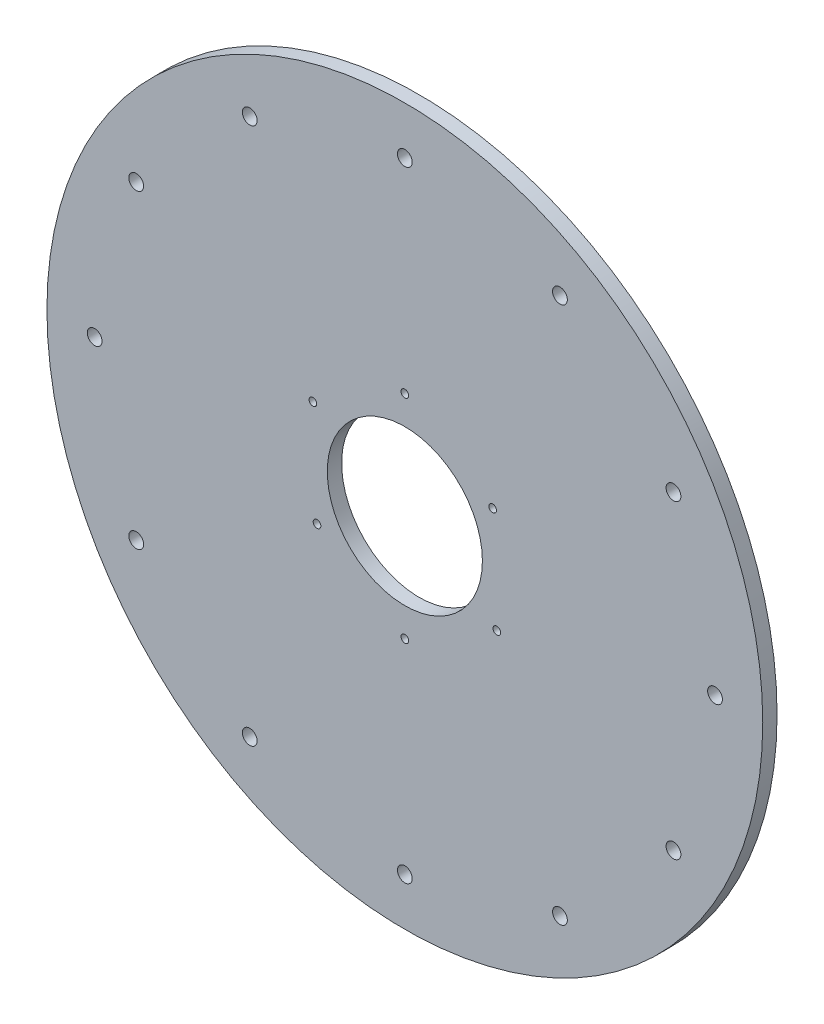
ISO-10303-21;
HEADER;
FILE_DESCRIPTION(('STEP AP214'),'2;1');
FILE_NAME('part.step','',(''),(''),'','','');
FILE_SCHEMA(('AUTOMOTIVE_DESIGN { 1 0 10303 214 1 1 1 1 }'));
ENDSEC;
DATA;
#1=APPLICATION_CONTEXT('core data for automotive mechanical design processes');
#2=APPLICATION_PROTOCOL_DEFINITION('international standard','automotive_design',2000,#1);
#3=PRODUCT_CONTEXT('',#1,'mechanical');
#4=PRODUCT('Part','Part','',(#3));
#5=PRODUCT_RELATED_PRODUCT_CATEGORY('part','',(#4));
#6=PRODUCT_DEFINITION_FORMATION('','',#4);
#7=PRODUCT_DEFINITION_CONTEXT('part definition',#1,'design');
#8=PRODUCT_DEFINITION('design','',#6,#7);
#9=PRODUCT_DEFINITION_SHAPE('','',#8);
#10=(LENGTH_UNIT() NAMED_UNIT(*) SI_UNIT(.MILLI.,.METRE.));
#11=(NAMED_UNIT(*) PLANE_ANGLE_UNIT() SI_UNIT($,.RADIAN.));
#12=(NAMED_UNIT(*) SI_UNIT($,.STERADIAN.) SOLID_ANGLE_UNIT());
#13=UNCERTAINTY_MEASURE_WITH_UNIT(LENGTH_MEASURE(1.E-05),#10,'distance_accuracy_value','');
#14=(GEOMETRIC_REPRESENTATION_CONTEXT(3) GLOBAL_UNCERTAINTY_ASSIGNED_CONTEXT((#13)) GLOBAL_UNIT_ASSIGNED_CONTEXT((#10,
#11,#12)) REPRESENTATION_CONTEXT('',''));
#15=CARTESIAN_POINT('',(0.,0.,0.));
#16=DIRECTION('',(0.,0.,1.));
#17=DIRECTION('',(1.,0.,0.));
#18=AXIS2_PLACEMENT_3D('',#15,#16,#17);
#19=CARTESIAN_POINT('',(0.,0.,6.));
#20=DIRECTION('',(0.,0.,1.));
#21=DIRECTION('',(1.,0.,0.));
#22=AXIS2_PLACEMENT_3D('',#19,#20,#21);
#23=PLANE('',#22);
#24=CARTESIAN_POINT('',(-38.5381304684075,22.25,6.));
#25=DIRECTION('',(0.,0.,1.));
#26=DIRECTION('',(1.,0.,0.));
#27=AXIS2_PLACEMENT_3D('',#24,#25,#26);
#28=CIRCLE('',#27,1.6);
#29=CARTESIAN_POINT('',(-36.9381304684075,22.25,6.));
#30=VERTEX_POINT('',#29);
#31=EDGE_CURVE('E151',#30,#30,#28,.T.);
#32=ORIENTED_EDGE('',*,*,#31,.F.);
#33=EDGE_LOOP('',(#32));
#34=FACE_BOUND('',#33,.T.);
#35=CARTESIAN_POINT('',(38.5381304684075,-22.25,6.));
#36=DIRECTION('',(0.,0.,1.));
#37=DIRECTION('',(1.,0.,0.));
#38=AXIS2_PLACEMENT_3D('',#35,#36,#37);
#39=CIRCLE('',#38,1.6);
#40=CARTESIAN_POINT('',(40.1381304684075,-22.25,6.));
#41=VERTEX_POINT('',#40);
#42=EDGE_CURVE('E139',#41,#41,#39,.T.);
#43=ORIENTED_EDGE('',*,*,#42,.F.);
#44=EDGE_LOOP('',(#43));
#45=FACE_BOUND('',#44,.T.);
#46=CARTESIAN_POINT('',(-65.,112.583302491977,6.));
#47=DIRECTION('',(0.,0.,1.));
#48=DIRECTION('',(1.,0.,0.));
#49=AXIS2_PLACEMENT_3D('',#46,#47,#48);
#50=CIRCLE('',#49,3.1);
#51=CARTESIAN_POINT('',(-61.9,112.583302491977,6.));
#52=VERTEX_POINT('',#51);
#53=EDGE_CURVE('E127',#52,#52,#50,.T.);
#54=ORIENTED_EDGE('',*,*,#53,.F.);
#55=EDGE_LOOP('',(#54));
#56=FACE_BOUND('',#55,.T.);
#57=CARTESIAN_POINT('',(-130.,0.,6.));
#58=DIRECTION('',(0.,0.,1.));
#59=DIRECTION('',(1.,0.,0.));
#60=AXIS2_PLACEMENT_3D('',#57,#58,#59);
#61=CIRCLE('',#60,3.09999999999999);
#62=CARTESIAN_POINT('',(-126.9,0.,6.));
#63=VERTEX_POINT('',#62);
#64=EDGE_CURVE('E115',#63,#63,#61,.T.);
#65=ORIENTED_EDGE('',*,*,#64,.F.);
#66=EDGE_LOOP('',(#65));
#67=FACE_BOUND('',#66,.T.);
#68=CARTESIAN_POINT('',(-65.,-112.583302491977,6.));
#69=DIRECTION('',(0.,0.,1.));
#70=DIRECTION('',(1.,0.,0.));
#71=AXIS2_PLACEMENT_3D('',#68,#69,#70);
#72=CIRCLE('',#71,3.1);
#73=CARTESIAN_POINT('',(-61.9,-112.583302491977,6.));
#74=VERTEX_POINT('',#73);
#75=EDGE_CURVE('E103',#74,#74,#72,.T.);
#76=ORIENTED_EDGE('',*,*,#75,.F.);
#77=EDGE_LOOP('',(#76));
#78=FACE_BOUND('',#77,.T.);
#79=CARTESIAN_POINT('',(65.,-112.583302491977,6.));
#80=DIRECTION('',(0.,0.,1.));
#81=DIRECTION('',(1.,0.,0.));
#82=AXIS2_PLACEMENT_3D('',#79,#80,#81);
#83=CIRCLE('',#82,3.1);
#84=CARTESIAN_POINT('',(68.1000000000001,-112.583302491977,6.));
#85=VERTEX_POINT('',#84);
#86=EDGE_CURVE('E91',#85,#85,#83,.T.);
#87=ORIENTED_EDGE('',*,*,#86,.F.);
#88=EDGE_LOOP('',(#87));
#89=FACE_BOUND('',#88,.T.);
#90=CARTESIAN_POINT('',(130.,0.,6.));
#91=DIRECTION('',(0.,0.,1.));
#92=DIRECTION('',(1.,0.,0.));
#93=AXIS2_PLACEMENT_3D('',#90,#91,#92);
#94=CIRCLE('',#93,3.09999999999999);
#95=CARTESIAN_POINT('',(133.1,0.,6.));
#96=VERTEX_POINT('',#95);
#97=EDGE_CURVE('E79',#96,#96,#94,.T.);
#98=ORIENTED_EDGE('',*,*,#97,.F.);
#99=EDGE_LOOP('',(#98));
#100=FACE_BOUND('',#99,.T.);
#101=CARTESIAN_POINT('',(65.,112.583302491977,6.));
#102=DIRECTION('',(0.,0.,1.));
#103=DIRECTION('',(1.,0.,0.));
#104=AXIS2_PLACEMENT_3D('',#101,#102,#103);
#105=CIRCLE('',#104,3.1);
#106=CARTESIAN_POINT('',(68.1,112.583302491977,6.));
#107=VERTEX_POINT('',#106);
#108=EDGE_CURVE('E67',#107,#107,#105,.T.);
#109=ORIENTED_EDGE('',*,*,#108,.F.);
#110=EDGE_LOOP('',(#109));
#111=FACE_BOUND('',#110,.T.);
#112=CARTESIAN_POINT('',(0.,130.,6.));
#113=DIRECTION('',(0.,0.,1.));
#114=DIRECTION('',(1.,0.,0.));
#115=AXIS2_PLACEMENT_3D('',#112,#113,#114);
#116=CIRCLE('',#115,3.1);
#117=CARTESIAN_POINT('',(3.1,130.,6.));
#118=VERTEX_POINT('',#117);
#119=EDGE_CURVE('E55',#118,#118,#116,.T.);
#120=ORIENTED_EDGE('',*,*,#119,.F.);
#121=EDGE_LOOP('',(#120));
#122=FACE_BOUND('',#121,.T.);
#123=CARTESIAN_POINT('',(0.,0.,6.));
#124=DIRECTION('',(0.,0.,1.));
#125=DIRECTION('',(1.,0.,0.));
#126=AXIS2_PLACEMENT_3D('',#123,#124,#125);
#127=CIRCLE('',#126,150.);
#128=CARTESIAN_POINT('',(150.,0.,6.));
#129=VERTEX_POINT('',#128);
#130=EDGE_CURVE('E10',#129,#129,#127,.T.);
#131=ORIENTED_EDGE('',*,*,#130,.T.);
#132=EDGE_LOOP('',(#131));
#133=FACE_BOUND('',#132,.T.);
#134=CARTESIAN_POINT('',(0.,0.,6.));
#135=DIRECTION('',(0.,0.,1.));
#136=DIRECTION('',(1.,0.,0.));
#137=AXIS2_PLACEMENT_3D('',#134,#135,#136);
#138=CIRCLE('',#137,32.5);
#139=CARTESIAN_POINT('',(32.5,0.,6.));
#140=VERTEX_POINT('',#139);
#141=EDGE_CURVE('E50',#140,#140,#138,.T.);
#142=ORIENTED_EDGE('',*,*,#141,.F.);
#143=EDGE_LOOP('',(#142));
#144=FACE_BOUND('',#143,.T.);
#145=CARTESIAN_POINT('',(0.,44.5,6.));
#146=DIRECTION('',(0.,0.,1.));
#147=DIRECTION('',(1.,0.,0.));
#148=AXIS2_PLACEMENT_3D('',#145,#146,#147);
#149=CIRCLE('',#148,1.6);
#150=CARTESIAN_POINT('',(1.6,44.5,6.));
#151=VERTEX_POINT('',#150);
#152=EDGE_CURVE('E61',#151,#151,#149,.T.);
#153=ORIENTED_EDGE('',*,*,#152,.F.);
#154=EDGE_LOOP('',(#153));
#155=FACE_BOUND('',#154,.T.);
#156=CARTESIAN_POINT('',(112.583302491977,65.,6.));
#157=DIRECTION('',(0.,0.,1.));
#158=DIRECTION('',(1.,0.,0.));
#159=AXIS2_PLACEMENT_3D('',#156,#157,#158);
#160=CIRCLE('',#159,3.1);
#161=CARTESIAN_POINT('',(115.683302491977,65.,6.));
#162=VERTEX_POINT('',#161);
#163=EDGE_CURVE('E73',#162,#162,#160,.T.);
#164=ORIENTED_EDGE('',*,*,#163,.F.);
#165=EDGE_LOOP('',(#164));
#166=FACE_BOUND('',#165,.T.);
#167=CARTESIAN_POINT('',(112.583302491977,-65.,6.));
#168=DIRECTION('',(0.,0.,1.));
#169=DIRECTION('',(1.,0.,0.));
#170=AXIS2_PLACEMENT_3D('',#167,#168,#169);
#171=CIRCLE('',#170,3.1);
#172=CARTESIAN_POINT('',(115.683302491977,-65.,6.));
#173=VERTEX_POINT('',#172);
#174=EDGE_CURVE('E85',#173,#173,#171,.T.);
#175=ORIENTED_EDGE('',*,*,#174,.F.);
#176=EDGE_LOOP('',(#175));
#177=FACE_BOUND('',#176,.T.);
#178=CARTESIAN_POINT('',(0.,-130.,6.));
#179=DIRECTION('',(0.,0.,1.));
#180=DIRECTION('',(1.,0.,0.));
#181=AXIS2_PLACEMENT_3D('',#178,#179,#180);
#182=CIRCLE('',#181,3.1);
#183=CARTESIAN_POINT('',(3.10000000000001,-130.,6.));
#184=VERTEX_POINT('',#183);
#185=EDGE_CURVE('E97',#184,#184,#182,.T.);
#186=ORIENTED_EDGE('',*,*,#185,.F.);
#187=EDGE_LOOP('',(#186));
#188=FACE_BOUND('',#187,.T.);
#189=CARTESIAN_POINT('',(-112.583302491977,-65.0000000000001,6.));
#190=DIRECTION('',(0.,0.,1.));
#191=DIRECTION('',(1.,0.,0.));
#192=AXIS2_PLACEMENT_3D('',#189,#190,#191);
#193=CIRCLE('',#192,3.1);
#194=CARTESIAN_POINT('',(-109.483302491977,-65.0000000000001,6.));
#195=VERTEX_POINT('',#194);
#196=EDGE_CURVE('E109',#195,#195,#193,.T.);
#197=ORIENTED_EDGE('',*,*,#196,.F.);
#198=EDGE_LOOP('',(#197));
#199=FACE_BOUND('',#198,.T.);
#200=CARTESIAN_POINT('',(-112.583302491977,64.9999999999999,6.));
#201=DIRECTION('',(0.,0.,1.));
#202=DIRECTION('',(1.,0.,0.));
#203=AXIS2_PLACEMENT_3D('',#200,#201,#202);
#204=CIRCLE('',#203,3.1);
#205=CARTESIAN_POINT('',(-109.483302491977,64.9999999999999,6.));
#206=VERTEX_POINT('',#205);
#207=EDGE_CURVE('E121',#206,#206,#204,.T.);
#208=ORIENTED_EDGE('',*,*,#207,.F.);
#209=EDGE_LOOP('',(#208));
#210=FACE_BOUND('',#209,.T.);
#211=CARTESIAN_POINT('',(36.8068296608386,21.2504330127019,6.));
#212=DIRECTION('',(0.,0.,1.));
#213=DIRECTION('',(1.,0.,0.));
#214=AXIS2_PLACEMENT_3D('',#211,#212,#213);
#215=CIRCLE('',#214,1.6);
#216=CARTESIAN_POINT('',(38.4068296608386,21.2504330127019,6.));
#217=VERTEX_POINT('',#216);
#218=EDGE_CURVE('E133',#217,#217,#215,.T.);
#219=ORIENTED_EDGE('',*,*,#218,.F.);
#220=EDGE_LOOP('',(#219));
#221=FACE_BOUND('',#220,.T.);
#222=CARTESIAN_POINT('',(0.,-44.5,6.));
#223=DIRECTION('',(0.,0.,1.));
#224=DIRECTION('',(1.,0.,0.));
#225=AXIS2_PLACEMENT_3D('',#222,#223,#224);
#226=CIRCLE('',#225,1.59999999999999);
#227=CARTESIAN_POINT('',(1.6,-44.5,6.));
#228=VERTEX_POINT('',#227);
#229=EDGE_CURVE('E145',#228,#228,#226,.T.);
#230=ORIENTED_EDGE('',*,*,#229,.F.);
#231=EDGE_LOOP('',(#230));
#232=FACE_BOUND('',#231,.T.);
#233=CARTESIAN_POINT('',(-36.8053296608386,-21.2495669872981,6.));
#234=DIRECTION('',(0.,0.,1.));
#235=DIRECTION('',(-1.,0.,0.));
#236=AXIS2_PLACEMENT_3D('',#233,#234,#235);
#237=CIRCLE('',#236,1.59999999999999);
#238=CARTESIAN_POINT('',(-38.4053296608386,-21.2495669872981,6.));
#239=VERTEX_POINT('',#238);
#240=EDGE_CURVE('E157',#239,#239,#237,.T.);
#241=ORIENTED_EDGE('',*,*,#240,.F.);
#242=EDGE_LOOP('',(#241));
#243=FACE_BOUND('',#242,.T.);
#244=ADVANCED_FACE('F39',(#34,#45,#56,#67,#78,#89,#100,#111,#122,#133,#144,#155,#166,#177,#188,
#199,#210,#221,#232,#243),#23,.T.);
#245=CARTESIAN_POINT('',(0.,0.,0.));
#246=DIRECTION('',(0.,0.,1.));
#247=DIRECTION('',(1.,0.,0.));
#248=AXIS2_PLACEMENT_3D('',#245,#246,#247);
#249=PLANE('',#248);
#250=CARTESIAN_POINT('',(0.,0.,0.));
#251=DIRECTION('',(0.,0.,1.));
#252=DIRECTION('',(1.,0.,0.));
#253=AXIS2_PLACEMENT_3D('',#250,#251,#252);
#254=CIRCLE('',#253,150.);
#255=CARTESIAN_POINT('',(150.,0.,0.));
#256=VERTEX_POINT('',#255);
#257=EDGE_CURVE('E43',#256,#256,#254,.T.);
#258=ORIENTED_EDGE('',*,*,#257,.F.);
#259=EDGE_LOOP('',(#258));
#260=FACE_BOUND('',#259,.T.);
#261=CARTESIAN_POINT('',(0.,0.,0.));
#262=DIRECTION('',(0.,0.,1.));
#263=DIRECTION('',(1.,0.,0.));
#264=AXIS2_PLACEMENT_3D('',#261,#262,#263);
#265=CIRCLE('',#264,32.5);
#266=CARTESIAN_POINT('',(32.5,0.,0.));
#267=VERTEX_POINT('',#266);
#268=EDGE_CURVE('E52',#267,#267,#265,.T.);
#269=ORIENTED_EDGE('',*,*,#268,.T.);
#270=EDGE_LOOP('',(#269));
#271=FACE_BOUND('',#270,.T.);
#272=CARTESIAN_POINT('',(0.,130.,0.));
#273=DIRECTION('',(0.,0.,1.));
#274=DIRECTION('',(1.,0.,0.));
#275=AXIS2_PLACEMENT_3D('',#272,#273,#274);
#276=CIRCLE('',#275,3.1);
#277=CARTESIAN_POINT('',(3.1,130.,0.));
#278=VERTEX_POINT('',#277);
#279=EDGE_CURVE('E58',#278,#278,#276,.T.);
#280=ORIENTED_EDGE('',*,*,#279,.T.);
#281=EDGE_LOOP('',(#280));
#282=FACE_BOUND('',#281,.T.);
#283=CARTESIAN_POINT('',(0.,44.5,0.));
#284=DIRECTION('',(0.,0.,1.));
#285=DIRECTION('',(1.,0.,0.));
#286=AXIS2_PLACEMENT_3D('',#283,#284,#285);
#287=CIRCLE('',#286,1.6);
#288=CARTESIAN_POINT('',(1.6,44.5,0.));
#289=VERTEX_POINT('',#288);
#290=EDGE_CURVE('E64',#289,#289,#287,.T.);
#291=ORIENTED_EDGE('',*,*,#290,.T.);
#292=EDGE_LOOP('',(#291));
#293=FACE_BOUND('',#292,.T.);
#294=CARTESIAN_POINT('',(65.,112.583302491977,0.));
#295=DIRECTION('',(0.,0.,1.));
#296=DIRECTION('',(1.,0.,0.));
#297=AXIS2_PLACEMENT_3D('',#294,#295,#296);
#298=CIRCLE('',#297,3.1);
#299=CARTESIAN_POINT('',(68.1,112.583302491977,0.));
#300=VERTEX_POINT('',#299);
#301=EDGE_CURVE('E70',#300,#300,#298,.T.);
#302=ORIENTED_EDGE('',*,*,#301,.T.);
#303=EDGE_LOOP('',(#302));
#304=FACE_BOUND('',#303,.T.);
#305=CARTESIAN_POINT('',(112.583302491977,65.,0.));
#306=DIRECTION('',(0.,0.,1.));
#307=DIRECTION('',(1.,0.,0.));
#308=AXIS2_PLACEMENT_3D('',#305,#306,#307);
#309=CIRCLE('',#308,3.1);
#310=CARTESIAN_POINT('',(115.683302491977,65.,0.));
#311=VERTEX_POINT('',#310);
#312=EDGE_CURVE('E76',#311,#311,#309,.T.);
#313=ORIENTED_EDGE('',*,*,#312,.T.);
#314=EDGE_LOOP('',(#313));
#315=FACE_BOUND('',#314,.T.);
#316=CARTESIAN_POINT('',(130.,0.,0.));
#317=DIRECTION('',(0.,0.,1.));
#318=DIRECTION('',(1.,0.,0.));
#319=AXIS2_PLACEMENT_3D('',#316,#317,#318);
#320=CIRCLE('',#319,3.09999999999999);
#321=CARTESIAN_POINT('',(133.1,0.,0.));
#322=VERTEX_POINT('',#321);
#323=EDGE_CURVE('E82',#322,#322,#320,.T.);
#324=ORIENTED_EDGE('',*,*,#323,.T.);
#325=EDGE_LOOP('',(#324));
#326=FACE_BOUND('',#325,.T.);
#327=CARTESIAN_POINT('',(112.583302491977,-65.,0.));
#328=DIRECTION('',(0.,0.,1.));
#329=DIRECTION('',(1.,0.,0.));
#330=AXIS2_PLACEMENT_3D('',#327,#328,#329);
#331=CIRCLE('',#330,3.1);
#332=CARTESIAN_POINT('',(115.683302491977,-65.,0.));
#333=VERTEX_POINT('',#332);
#334=EDGE_CURVE('E88',#333,#333,#331,.T.);
#335=ORIENTED_EDGE('',*,*,#334,.T.);
#336=EDGE_LOOP('',(#335));
#337=FACE_BOUND('',#336,.T.);
#338=CARTESIAN_POINT('',(65.,-112.583302491977,0.));
#339=DIRECTION('',(0.,0.,1.));
#340=DIRECTION('',(1.,0.,0.));
#341=AXIS2_PLACEMENT_3D('',#338,#339,#340);
#342=CIRCLE('',#341,3.1);
#343=CARTESIAN_POINT('',(68.1000000000001,-112.583302491977,0.));
#344=VERTEX_POINT('',#343);
#345=EDGE_CURVE('E94',#344,#344,#342,.T.);
#346=ORIENTED_EDGE('',*,*,#345,.T.);
#347=EDGE_LOOP('',(#346));
#348=FACE_BOUND('',#347,.T.);
#349=CARTESIAN_POINT('',(0.,-130.,0.));
#350=DIRECTION('',(0.,0.,1.));
#351=DIRECTION('',(1.,0.,0.));
#352=AXIS2_PLACEMENT_3D('',#349,#350,#351);
#353=CIRCLE('',#352,3.1);
#354=CARTESIAN_POINT('',(3.10000000000001,-130.,0.));
#355=VERTEX_POINT('',#354);
#356=EDGE_CURVE('E100',#355,#355,#353,.T.);
#357=ORIENTED_EDGE('',*,*,#356,.T.);
#358=EDGE_LOOP('',(#357));
#359=FACE_BOUND('',#358,.T.);
#360=CARTESIAN_POINT('',(-65.,-112.583302491977,0.));
#361=DIRECTION('',(0.,0.,1.));
#362=DIRECTION('',(1.,0.,0.));
#363=AXIS2_PLACEMENT_3D('',#360,#361,#362);
#364=CIRCLE('',#363,3.1);
#365=CARTESIAN_POINT('',(-61.9,-112.583302491977,0.));
#366=VERTEX_POINT('',#365);
#367=EDGE_CURVE('E106',#366,#366,#364,.T.);
#368=ORIENTED_EDGE('',*,*,#367,.T.);
#369=EDGE_LOOP('',(#368));
#370=FACE_BOUND('',#369,.T.);
#371=CARTESIAN_POINT('',(-112.583302491977,-65.0000000000001,0.));
#372=DIRECTION('',(0.,0.,1.));
#373=DIRECTION('',(1.,0.,0.));
#374=AXIS2_PLACEMENT_3D('',#371,#372,#373);
#375=CIRCLE('',#374,3.1);
#376=CARTESIAN_POINT('',(-109.483302491977,-65.0000000000001,0.));
#377=VERTEX_POINT('',#376);
#378=EDGE_CURVE('E112',#377,#377,#375,.T.);
#379=ORIENTED_EDGE('',*,*,#378,.T.);
#380=EDGE_LOOP('',(#379));
#381=FACE_BOUND('',#380,.T.);
#382=CARTESIAN_POINT('',(-130.,0.,0.));
#383=DIRECTION('',(0.,0.,1.));
#384=DIRECTION('',(1.,0.,0.));
#385=AXIS2_PLACEMENT_3D('',#382,#383,#384);
#386=CIRCLE('',#385,3.09999999999999);
#387=CARTESIAN_POINT('',(-126.9,0.,0.));
#388=VERTEX_POINT('',#387);
#389=EDGE_CURVE('E118',#388,#388,#386,.T.);
#390=ORIENTED_EDGE('',*,*,#389,.T.);
#391=EDGE_LOOP('',(#390));
#392=FACE_BOUND('',#391,.T.);
#393=CARTESIAN_POINT('',(-112.583302491977,64.9999999999999,0.));
#394=DIRECTION('',(0.,0.,1.));
#395=DIRECTION('',(1.,0.,0.));
#396=AXIS2_PLACEMENT_3D('',#393,#394,#395);
#397=CIRCLE('',#396,3.1);
#398=CARTESIAN_POINT('',(-109.483302491977,64.9999999999999,0.));
#399=VERTEX_POINT('',#398);
#400=EDGE_CURVE('E124',#399,#399,#397,.T.);
#401=ORIENTED_EDGE('',*,*,#400,.T.);
#402=EDGE_LOOP('',(#401));
#403=FACE_BOUND('',#402,.T.);
#404=CARTESIAN_POINT('',(-65.,112.583302491977,0.));
#405=DIRECTION('',(0.,0.,1.));
#406=DIRECTION('',(1.,0.,0.));
#407=AXIS2_PLACEMENT_3D('',#404,#405,#406);
#408=CIRCLE('',#407,3.1);
#409=CARTESIAN_POINT('',(-61.9,112.583302491977,0.));
#410=VERTEX_POINT('',#409);
#411=EDGE_CURVE('E130',#410,#410,#408,.T.);
#412=ORIENTED_EDGE('',*,*,#411,.T.);
#413=EDGE_LOOP('',(#412));
#414=FACE_BOUND('',#413,.T.);
#415=CARTESIAN_POINT('',(36.8068296608386,21.2504330127019,0.));
#416=DIRECTION('',(0.,0.,1.));
#417=DIRECTION('',(1.,0.,0.));
#418=AXIS2_PLACEMENT_3D('',#415,#416,#417);
#419=CIRCLE('',#418,1.6);
#420=CARTESIAN_POINT('',(38.4068296608386,21.2504330127019,0.));
#421=VERTEX_POINT('',#420);
#422=EDGE_CURVE('E136',#421,#421,#419,.T.);
#423=ORIENTED_EDGE('',*,*,#422,.T.);
#424=EDGE_LOOP('',(#423));
#425=FACE_BOUND('',#424,.T.);
#426=CARTESIAN_POINT('',(38.5381304684075,-22.25,0.));
#427=DIRECTION('',(0.,0.,1.));
#428=DIRECTION('',(1.,0.,0.));
#429=AXIS2_PLACEMENT_3D('',#426,#427,#428);
#430=CIRCLE('',#429,1.6);
#431=CARTESIAN_POINT('',(40.1381304684075,-22.25,0.));
#432=VERTEX_POINT('',#431);
#433=EDGE_CURVE('E142',#432,#432,#430,.T.);
#434=ORIENTED_EDGE('',*,*,#433,.T.);
#435=EDGE_LOOP('',(#434));
#436=FACE_BOUND('',#435,.T.);
#437=CARTESIAN_POINT('',(0.,-44.5,0.));
#438=DIRECTION('',(0.,0.,1.));
#439=DIRECTION('',(1.,0.,0.));
#440=AXIS2_PLACEMENT_3D('',#437,#438,#439);
#441=CIRCLE('',#440,1.59999999999999);
#442=CARTESIAN_POINT('',(1.6,-44.5,0.));
#443=VERTEX_POINT('',#442);
#444=EDGE_CURVE('E148',#443,#443,#441,.T.);
#445=ORIENTED_EDGE('',*,*,#444,.T.);
#446=EDGE_LOOP('',(#445));
#447=FACE_BOUND('',#446,.T.);
#448=CARTESIAN_POINT('',(-38.5381304684075,22.25,0.));
#449=DIRECTION('',(0.,0.,1.));
#450=DIRECTION('',(1.,0.,0.));
#451=AXIS2_PLACEMENT_3D('',#448,#449,#450);
#452=CIRCLE('',#451,1.6);
#453=CARTESIAN_POINT('',(-36.9381304684075,22.25,0.));
#454=VERTEX_POINT('',#453);
#455=EDGE_CURVE('E154',#454,#454,#452,.T.);
#456=ORIENTED_EDGE('',*,*,#455,.T.);
#457=EDGE_LOOP('',(#456));
#458=FACE_BOUND('',#457,.T.);
#459=CARTESIAN_POINT('',(-36.8053296608386,-21.2495669872981,0.));
#460=DIRECTION('',(0.,0.,1.));
#461=DIRECTION('',(-1.,0.,0.));
#462=AXIS2_PLACEMENT_3D('',#459,#460,#461);
#463=CIRCLE('',#462,1.59999999999999);
#464=CARTESIAN_POINT('',(-38.4053296608386,-21.2495669872981,0.));
#465=VERTEX_POINT('',#464);
#466=EDGE_CURVE('E160',#465,#465,#463,.T.);
#467=ORIENTED_EDGE('',*,*,#466,.T.);
#468=EDGE_LOOP('',(#467));
#469=FACE_BOUND('',#468,.T.);
#470=ADVANCED_FACE('F170',(#260,#271,#282,#293,#304,#315,#326,#337,#348,#359,#370,#381,#392,
#403,#414,#425,#436,#447,#458,#469),#249,.F.);
#471=CARTESIAN_POINT('',(0.,0.,6.));
#472=DIRECTION('',(0.,0.,-1.));
#473=DIRECTION('',(-1.,0.,0.));
#474=AXIS2_PLACEMENT_3D('',#471,#472,#473);
#475=CYLINDRICAL_SURFACE('',#474,150.);
#476=ORIENTED_EDGE('',*,*,#130,.F.);
#477=EDGE_LOOP('',(#476));
#478=FACE_BOUND('',#477,.T.);
#479=ORIENTED_EDGE('',*,*,#257,.T.);
#480=EDGE_LOOP('',(#479));
#481=FACE_BOUND('',#480,.T.);
#482=ADVANCED_FACE('F41',(#478,#481),#475,.T.);
#483=CARTESIAN_POINT('',(0.,0.,6.));
#484=DIRECTION('',(0.,0.,-1.));
#485=DIRECTION('',(-1.,0.,0.));
#486=AXIS2_PLACEMENT_3D('',#483,#484,#485);
#487=CYLINDRICAL_SURFACE('',#486,32.5);
#488=ORIENTED_EDGE('',*,*,#141,.T.);
#489=EDGE_LOOP('',(#488));
#490=FACE_BOUND('',#489,.T.);
#491=ORIENTED_EDGE('',*,*,#268,.F.);
#492=EDGE_LOOP('',(#491));
#493=FACE_BOUND('',#492,.T.);
#494=ADVANCED_FACE('F180',(#490,#493),#487,.F.);
#495=CARTESIAN_POINT('',(0.,130.,6.));
#496=DIRECTION('',(0.,0.,-1.));
#497=DIRECTION('',(-1.,0.,0.));
#498=AXIS2_PLACEMENT_3D('',#495,#496,#497);
#499=CYLINDRICAL_SURFACE('',#498,3.1);
#500=ORIENTED_EDGE('',*,*,#119,.T.);
#501=EDGE_LOOP('',(#500));
#502=FACE_BOUND('',#501,.T.);
#503=ORIENTED_EDGE('',*,*,#279,.F.);
#504=EDGE_LOOP('',(#503));
#505=FACE_BOUND('',#504,.T.);
#506=ADVANCED_FACE('F183',(#502,#505),#499,.F.);
#507=CARTESIAN_POINT('',(0.,44.5,6.));
#508=DIRECTION('',(0.,0.,-1.));
#509=DIRECTION('',(-1.,0.,0.));
#510=AXIS2_PLACEMENT_3D('',#507,#508,#509);
#511=CYLINDRICAL_SURFACE('',#510,1.6);
#512=ORIENTED_EDGE('',*,*,#152,.T.);
#513=EDGE_LOOP('',(#512));
#514=FACE_BOUND('',#513,.T.);
#515=ORIENTED_EDGE('',*,*,#290,.F.);
#516=EDGE_LOOP('',(#515));
#517=FACE_BOUND('',#516,.T.);
#518=ADVANCED_FACE('F187',(#514,#517),#511,.F.);
#519=CARTESIAN_POINT('',(65.,112.583302491977,6.));
#520=DIRECTION('',(0.,0.,-1.));
#521=DIRECTION('',(-1.,0.,0.));
#522=AXIS2_PLACEMENT_3D('',#519,#520,#521);
#523=CYLINDRICAL_SURFACE('',#522,3.1);
#524=ORIENTED_EDGE('',*,*,#108,.T.);
#525=EDGE_LOOP('',(#524));
#526=FACE_BOUND('',#525,.T.);
#527=ORIENTED_EDGE('',*,*,#301,.F.);
#528=EDGE_LOOP('',(#527));
#529=FACE_BOUND('',#528,.T.);
#530=ADVANCED_FACE('F191',(#526,#529),#523,.F.);
#531=CARTESIAN_POINT('',(112.583302491977,65.,6.));
#532=DIRECTION('',(0.,0.,-1.));
#533=DIRECTION('',(-1.,0.,0.));
#534=AXIS2_PLACEMENT_3D('',#531,#532,#533);
#535=CYLINDRICAL_SURFACE('',#534,3.1);
#536=ORIENTED_EDGE('',*,*,#163,.T.);
#537=EDGE_LOOP('',(#536));
#538=FACE_BOUND('',#537,.T.);
#539=ORIENTED_EDGE('',*,*,#312,.F.);
#540=EDGE_LOOP('',(#539));
#541=FACE_BOUND('',#540,.T.);
#542=ADVANCED_FACE('F195',(#538,#541),#535,.F.);
#543=CARTESIAN_POINT('',(130.,0.,6.));
#544=DIRECTION('',(0.,0.,-1.));
#545=DIRECTION('',(-1.,0.,0.));
#546=AXIS2_PLACEMENT_3D('',#543,#544,#545);
#547=CYLINDRICAL_SURFACE('',#546,3.09999999999999);
#548=ORIENTED_EDGE('',*,*,#97,.T.);
#549=EDGE_LOOP('',(#548));
#550=FACE_BOUND('',#549,.T.);
#551=ORIENTED_EDGE('',*,*,#323,.F.);
#552=EDGE_LOOP('',(#551));
#553=FACE_BOUND('',#552,.T.);
#554=ADVANCED_FACE('F199',(#550,#553),#547,.F.);
#555=CARTESIAN_POINT('',(112.583302491977,-65.,6.));
#556=DIRECTION('',(0.,0.,-1.));
#557=DIRECTION('',(-1.,0.,0.));
#558=AXIS2_PLACEMENT_3D('',#555,#556,#557);
#559=CYLINDRICAL_SURFACE('',#558,3.1);
#560=ORIENTED_EDGE('',*,*,#174,.T.);
#561=EDGE_LOOP('',(#560));
#562=FACE_BOUND('',#561,.T.);
#563=ORIENTED_EDGE('',*,*,#334,.F.);
#564=EDGE_LOOP('',(#563));
#565=FACE_BOUND('',#564,.T.);
#566=ADVANCED_FACE('F203',(#562,#565),#559,.F.);
#567=CARTESIAN_POINT('',(65.,-112.583302491977,6.));
#568=DIRECTION('',(0.,0.,-1.));
#569=DIRECTION('',(-1.,0.,0.));
#570=AXIS2_PLACEMENT_3D('',#567,#568,#569);
#571=CYLINDRICAL_SURFACE('',#570,3.1);
#572=ORIENTED_EDGE('',*,*,#86,.T.);
#573=EDGE_LOOP('',(#572));
#574=FACE_BOUND('',#573,.T.);
#575=ORIENTED_EDGE('',*,*,#345,.F.);
#576=EDGE_LOOP('',(#575));
#577=FACE_BOUND('',#576,.T.);
#578=ADVANCED_FACE('F207',(#574,#577),#571,.F.);
#579=CARTESIAN_POINT('',(0.,-130.,6.));
#580=DIRECTION('',(0.,0.,-1.));
#581=DIRECTION('',(-1.,0.,0.));
#582=AXIS2_PLACEMENT_3D('',#579,#580,#581);
#583=CYLINDRICAL_SURFACE('',#582,3.1);
#584=ORIENTED_EDGE('',*,*,#185,.T.);
#585=EDGE_LOOP('',(#584));
#586=FACE_BOUND('',#585,.T.);
#587=ORIENTED_EDGE('',*,*,#356,.F.);
#588=EDGE_LOOP('',(#587));
#589=FACE_BOUND('',#588,.T.);
#590=ADVANCED_FACE('F211',(#586,#589),#583,.F.);
#591=CARTESIAN_POINT('',(-65.,-112.583302491977,6.));
#592=DIRECTION('',(0.,0.,-1.));
#593=DIRECTION('',(-1.,0.,0.));
#594=AXIS2_PLACEMENT_3D('',#591,#592,#593);
#595=CYLINDRICAL_SURFACE('',#594,3.1);
#596=ORIENTED_EDGE('',*,*,#75,.T.);
#597=EDGE_LOOP('',(#596));
#598=FACE_BOUND('',#597,.T.);
#599=ORIENTED_EDGE('',*,*,#367,.F.);
#600=EDGE_LOOP('',(#599));
#601=FACE_BOUND('',#600,.T.);
#602=ADVANCED_FACE('F215',(#598,#601),#595,.F.);
#603=CARTESIAN_POINT('',(-112.583302491977,-65.0000000000001,6.));
#604=DIRECTION('',(0.,0.,-1.));
#605=DIRECTION('',(-1.,0.,0.));
#606=AXIS2_PLACEMENT_3D('',#603,#604,#605);
#607=CYLINDRICAL_SURFACE('',#606,3.1);
#608=ORIENTED_EDGE('',*,*,#196,.T.);
#609=EDGE_LOOP('',(#608));
#610=FACE_BOUND('',#609,.T.);
#611=ORIENTED_EDGE('',*,*,#378,.F.);
#612=EDGE_LOOP('',(#611));
#613=FACE_BOUND('',#612,.T.);
#614=ADVANCED_FACE('F219',(#610,#613),#607,.F.);
#615=CARTESIAN_POINT('',(-130.,0.,6.));
#616=DIRECTION('',(0.,0.,-1.));
#617=DIRECTION('',(-1.,0.,0.));
#618=AXIS2_PLACEMENT_3D('',#615,#616,#617);
#619=CYLINDRICAL_SURFACE('',#618,3.09999999999999);
#620=ORIENTED_EDGE('',*,*,#64,.T.);
#621=EDGE_LOOP('',(#620));
#622=FACE_BOUND('',#621,.T.);
#623=ORIENTED_EDGE('',*,*,#389,.F.);
#624=EDGE_LOOP('',(#623));
#625=FACE_BOUND('',#624,.T.);
#626=ADVANCED_FACE('F223',(#622,#625),#619,.F.);
#627=CARTESIAN_POINT('',(-112.583302491977,64.9999999999999,6.));
#628=DIRECTION('',(0.,0.,-1.));
#629=DIRECTION('',(-1.,0.,0.));
#630=AXIS2_PLACEMENT_3D('',#627,#628,#629);
#631=CYLINDRICAL_SURFACE('',#630,3.1);
#632=ORIENTED_EDGE('',*,*,#207,.T.);
#633=EDGE_LOOP('',(#632));
#634=FACE_BOUND('',#633,.T.);
#635=ORIENTED_EDGE('',*,*,#400,.F.);
#636=EDGE_LOOP('',(#635));
#637=FACE_BOUND('',#636,.T.);
#638=ADVANCED_FACE('F227',(#634,#637),#631,.F.);
#639=CARTESIAN_POINT('',(-65.,112.583302491977,6.));
#640=DIRECTION('',(0.,0.,-1.));
#641=DIRECTION('',(-1.,0.,0.));
#642=AXIS2_PLACEMENT_3D('',#639,#640,#641);
#643=CYLINDRICAL_SURFACE('',#642,3.1);
#644=ORIENTED_EDGE('',*,*,#53,.T.);
#645=EDGE_LOOP('',(#644));
#646=FACE_BOUND('',#645,.T.);
#647=ORIENTED_EDGE('',*,*,#411,.F.);
#648=EDGE_LOOP('',(#647));
#649=FACE_BOUND('',#648,.T.);
#650=ADVANCED_FACE('F231',(#646,#649),#643,.F.);
#651=CARTESIAN_POINT('',(36.8068296608386,21.2504330127019,6.));
#652=DIRECTION('',(0.,0.,-1.));
#653=DIRECTION('',(-1.,0.,0.));
#654=AXIS2_PLACEMENT_3D('',#651,#652,#653);
#655=CYLINDRICAL_SURFACE('',#654,1.6);
#656=ORIENTED_EDGE('',*,*,#218,.T.);
#657=EDGE_LOOP('',(#656));
#658=FACE_BOUND('',#657,.T.);
#659=ORIENTED_EDGE('',*,*,#422,.F.);
#660=EDGE_LOOP('',(#659));
#661=FACE_BOUND('',#660,.T.);
#662=ADVANCED_FACE('F235',(#658,#661),#655,.F.);
#663=CARTESIAN_POINT('',(38.5381304684075,-22.25,6.));
#664=DIRECTION('',(0.,0.,-1.));
#665=DIRECTION('',(-1.,0.,0.));
#666=AXIS2_PLACEMENT_3D('',#663,#664,#665);
#667=CYLINDRICAL_SURFACE('',#666,1.6);
#668=ORIENTED_EDGE('',*,*,#42,.T.);
#669=EDGE_LOOP('',(#668));
#670=FACE_BOUND('',#669,.T.);
#671=ORIENTED_EDGE('',*,*,#433,.F.);
#672=EDGE_LOOP('',(#671));
#673=FACE_BOUND('',#672,.T.);
#674=ADVANCED_FACE('F239',(#670,#673),#667,.F.);
#675=CARTESIAN_POINT('',(0.,-44.5,6.));
#676=DIRECTION('',(0.,0.,-1.));
#677=DIRECTION('',(-1.,0.,0.));
#678=AXIS2_PLACEMENT_3D('',#675,#676,#677);
#679=CYLINDRICAL_SURFACE('',#678,1.59999999999999);
#680=ORIENTED_EDGE('',*,*,#229,.T.);
#681=EDGE_LOOP('',(#680));
#682=FACE_BOUND('',#681,.T.);
#683=ORIENTED_EDGE('',*,*,#444,.F.);
#684=EDGE_LOOP('',(#683));
#685=FACE_BOUND('',#684,.T.);
#686=ADVANCED_FACE('F243',(#682,#685),#679,.F.);
#687=CARTESIAN_POINT('',(-38.5381304684075,22.25,6.));
#688=DIRECTION('',(0.,0.,-1.));
#689=DIRECTION('',(-1.,0.,0.));
#690=AXIS2_PLACEMENT_3D('',#687,#688,#689);
#691=CYLINDRICAL_SURFACE('',#690,1.6);
#692=ORIENTED_EDGE('',*,*,#31,.T.);
#693=EDGE_LOOP('',(#692));
#694=FACE_BOUND('',#693,.T.);
#695=ORIENTED_EDGE('',*,*,#455,.F.);
#696=EDGE_LOOP('',(#695));
#697=FACE_BOUND('',#696,.T.);
#698=ADVANCED_FACE('F247',(#694,#697),#691,.F.);
#699=CARTESIAN_POINT('',(-36.8053296608386,-21.2495669872981,6.));
#700=DIRECTION('',(0.,0.,-1.));
#701=DIRECTION('',(-1.,0.,0.));
#702=AXIS2_PLACEMENT_3D('',#699,#700,#701);
#703=CYLINDRICAL_SURFACE('',#702,1.59999999999999);
#704=ORIENTED_EDGE('',*,*,#240,.T.);
#705=EDGE_LOOP('',(#704));
#706=FACE_BOUND('',#705,.T.);
#707=ORIENTED_EDGE('',*,*,#466,.F.);
#708=EDGE_LOOP('',(#707));
#709=FACE_BOUND('',#708,.T.);
#710=ADVANCED_FACE('F166',(#706,#709),#703,.F.);
#711=CLOSED_SHELL('',(#244,#470,#482,#494,#506,#518,#530,#542,#554,#566,#578,#590,#602,#614,
#626,#638,#650,#662,#674,#686,#698,#710));
#712=MANIFOLD_SOLID_BREP('B2',#711);
#713=ADVANCED_BREP_SHAPE_REPRESENTATION('',(#18,#712),#14);
#714=SHAPE_DEFINITION_REPRESENTATION(#9,#713);
ENDSEC;
END-ISO-10303-21;
